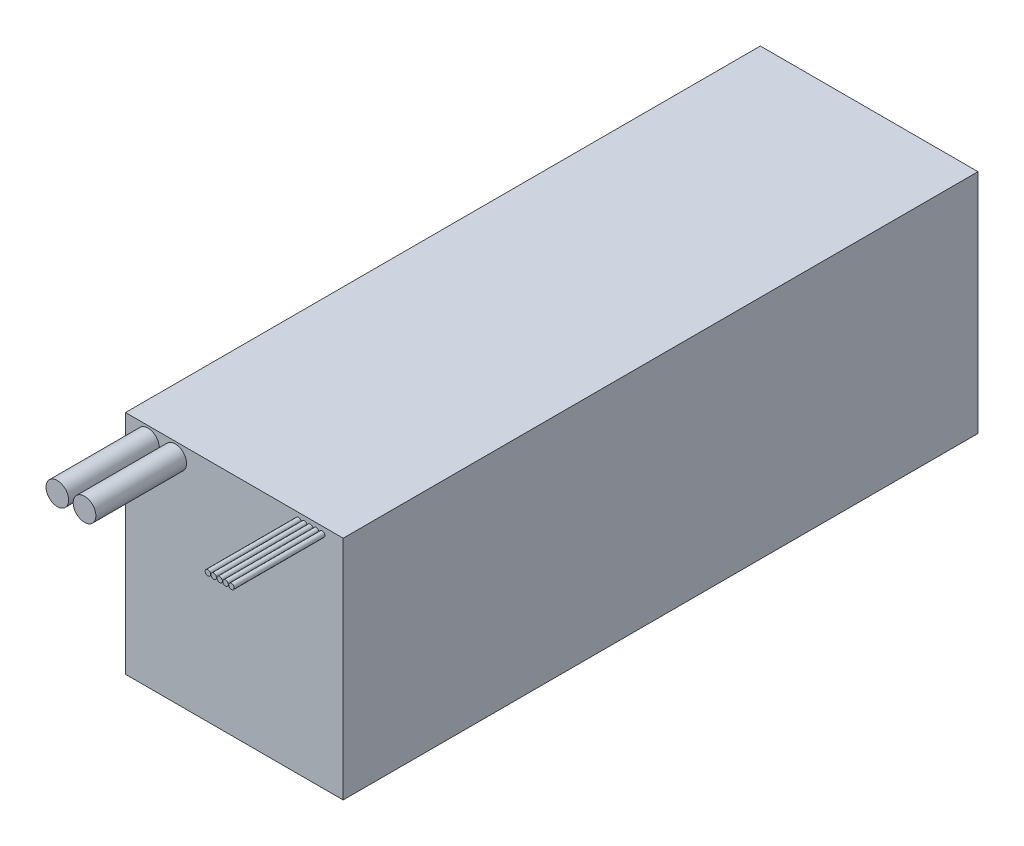
ISO-10303-21;
HEADER;
FILE_DESCRIPTION(('STEP AP214'),'2;1');
FILE_NAME('part.step','',(''),(''),'','','');
FILE_SCHEMA(('AUTOMOTIVE_DESIGN { 1 0 10303 214 1 1 1 1 }'));
ENDSEC;
DATA;
#1=APPLICATION_CONTEXT('core data for automotive mechanical design processes');
#2=APPLICATION_PROTOCOL_DEFINITION('international standard','automotive_design',2000,#1);
#3=PRODUCT_CONTEXT('',#1,'mechanical');
#4=PRODUCT('Part','Part','',(#3));
#5=PRODUCT_RELATED_PRODUCT_CATEGORY('part','',(#4));
#6=PRODUCT_DEFINITION_FORMATION('','',#4);
#7=PRODUCT_DEFINITION_CONTEXT('part definition',#1,'design');
#8=PRODUCT_DEFINITION('design','',#6,#7);
#9=PRODUCT_DEFINITION_SHAPE('','',#8);
#10=(LENGTH_UNIT() NAMED_UNIT(*) SI_UNIT(.MILLI.,.METRE.));
#11=(NAMED_UNIT(*) PLANE_ANGLE_UNIT() SI_UNIT($,.RADIAN.));
#12=(NAMED_UNIT(*) SI_UNIT($,.STERADIAN.) SOLID_ANGLE_UNIT());
#13=UNCERTAINTY_MEASURE_WITH_UNIT(LENGTH_MEASURE(1.E-05),#10,'distance_accuracy_value','');
#14=(GEOMETRIC_REPRESENTATION_CONTEXT(3) GLOBAL_UNCERTAINTY_ASSIGNED_CONTEXT((#13)) GLOBAL_UNIT_ASSIGNED_CONTEXT((#10,
#11,#12)) REPRESENTATION_CONTEXT('',''));
#15=CARTESIAN_POINT('',(0.,0.,0.));
#16=DIRECTION('',(0.,0.,1.));
#17=DIRECTION('',(1.,0.,0.));
#18=AXIS2_PLACEMENT_3D('',#15,#16,#17);
#19=CARTESIAN_POINT('',(-24.,25.,70.));
#20=DIRECTION('',(1.,0.,0.));
#21=DIRECTION('',(0.,1.,0.));
#22=AXIS2_PLACEMENT_3D('',#19,#20,#21);
#23=PLANE('',#22);
#24=DIRECTION('',(0.,-1.,0.));
#25=VECTOR('',#24,1.);
#26=CARTESIAN_POINT('',(-24.,25.,-70.));
#27=LINE('',#26,#25);
#28=CARTESIAN_POINT('',(-24.,25.,-70.));
#29=VERTEX_POINT('',#28);
#30=CARTESIAN_POINT('',(-24.,-25.,-70.));
#31=VERTEX_POINT('',#30);
#32=EDGE_CURVE('E99',#29,#31,#27,.T.);
#33=ORIENTED_EDGE('',*,*,#32,.T.);
#34=DIRECTION('',(0.,0.,-1.));
#35=VECTOR('',#34,1.);
#36=CARTESIAN_POINT('',(-24.,-25.,70.));
#37=LINE('',#36,#35);
#38=CARTESIAN_POINT('',(-24.,-25.,70.));
#39=VERTEX_POINT('',#38);
#40=EDGE_CURVE('E11',#39,#31,#37,.T.);
#41=ORIENTED_EDGE('',*,*,#40,.F.);
#42=DIRECTION('',(0.,-1.,0.));
#43=VECTOR('',#42,1.);
#44=CARTESIAN_POINT('',(-24.,25.,70.));
#45=LINE('',#44,#43);
#46=CARTESIAN_POINT('',(-24.,25.,70.));
#47=VERTEX_POINT('',#46);
#48=EDGE_CURVE('E87',#47,#39,#45,.T.);
#49=ORIENTED_EDGE('',*,*,#48,.F.);
#50=DIRECTION('',(0.,0.,-1.));
#51=VECTOR('',#50,1.);
#52=CARTESIAN_POINT('',(-24.,25.,70.));
#53=LINE('',#52,#51);
#54=EDGE_CURVE('E95',#47,#29,#53,.T.);
#55=ORIENTED_EDGE('',*,*,#54,.T.);
#56=EDGE_LOOP('',(#33,#41,#49,#55));
#57=FACE_BOUND('',#56,.T.);
#58=ADVANCED_FACE('F36',(#57),#23,.F.);
#59=CARTESIAN_POINT('',(-24.,-25.,70.));
#60=DIRECTION('',(0.,1.,0.));
#61=DIRECTION('',(0.,0.,1.));
#62=AXIS2_PLACEMENT_3D('',#59,#60,#61);
#63=PLANE('',#62);
#64=DIRECTION('',(1.,0.,0.));
#65=VECTOR('',#64,1.);
#66=CARTESIAN_POINT('',(-24.,-25.,-70.));
#67=LINE('',#66,#65);
#68=CARTESIAN_POINT('',(24.,-25.,-70.));
#69=VERTEX_POINT('',#68);
#70=EDGE_CURVE('E91',#31,#69,#67,.T.);
#71=ORIENTED_EDGE('',*,*,#70,.T.);
#72=DIRECTION('',(0.,0.,-1.));
#73=VECTOR('',#72,1.);
#74=CARTESIAN_POINT('',(24.,-25.,70.));
#75=LINE('',#74,#73);
#76=CARTESIAN_POINT('',(24.,-25.,70.));
#77=VERTEX_POINT('',#76);
#78=EDGE_CURVE('E44',#77,#69,#75,.T.);
#79=ORIENTED_EDGE('',*,*,#78,.F.);
#80=DIRECTION('',(1.,0.,0.));
#81=VECTOR('',#80,1.);
#82=CARTESIAN_POINT('',(-24.,-25.,70.));
#83=LINE('',#82,#81);
#84=EDGE_CURVE('E82',#39,#77,#83,.T.);
#85=ORIENTED_EDGE('',*,*,#84,.F.);
#86=ORIENTED_EDGE('',*,*,#40,.T.);
#87=EDGE_LOOP('',(#71,#79,#85,#86));
#88=FACE_BOUND('',#87,.T.);
#89=ADVANCED_FACE('F90',(#88),#63,.F.);
#90=CARTESIAN_POINT('',(24.,25.,70.));
#91=DIRECTION('',(-1.,0.,0.));
#92=DIRECTION('',(0.,0.,1.));
#93=AXIS2_PLACEMENT_3D('',#90,#91,#92);
#94=PLANE('',#93);
#95=DIRECTION('',(0.,1.,0.));
#96=VECTOR('',#95,1.);
#97=CARTESIAN_POINT('',(24.,25.,-70.));
#98=LINE('',#97,#96);
#99=CARTESIAN_POINT('',(24.,25.,-70.));
#100=VERTEX_POINT('',#99);
#101=EDGE_CURVE('E69',#69,#100,#98,.T.);
#102=ORIENTED_EDGE('',*,*,#101,.T.);
#103=DIRECTION('',(0.,0.,-1.));
#104=VECTOR('',#103,1.);
#105=CARTESIAN_POINT('',(24.,25.,70.));
#106=LINE('',#105,#104);
#107=CARTESIAN_POINT('',(24.,25.,70.));
#108=VERTEX_POINT('',#107);
#109=EDGE_CURVE('E92',#108,#100,#106,.T.);
#110=ORIENTED_EDGE('',*,*,#109,.F.);
#111=DIRECTION('',(0.,1.,0.));
#112=VECTOR('',#111,1.);
#113=CARTESIAN_POINT('',(24.,25.,70.));
#114=LINE('',#113,#112);
#115=EDGE_CURVE('E85',#77,#108,#114,.T.);
#116=ORIENTED_EDGE('',*,*,#115,.F.);
#117=ORIENTED_EDGE('',*,*,#78,.T.);
#118=EDGE_LOOP('',(#102,#110,#116,#117));
#119=FACE_BOUND('',#118,.T.);
#120=ADVANCED_FACE('F93',(#119),#94,.F.);
#121=CARTESIAN_POINT('',(-24.,25.,70.));
#122=DIRECTION('',(0.,-1.,0.));
#123=DIRECTION('',(0.,0.,-1.));
#124=AXIS2_PLACEMENT_3D('',#121,#122,#123);
#125=PLANE('',#124);
#126=DIRECTION('',(-1.,0.,0.));
#127=VECTOR('',#126,1.);
#128=CARTESIAN_POINT('',(-24.,25.,-70.));
#129=LINE('',#128,#127);
#130=EDGE_CURVE('E75',#100,#29,#129,.T.);
#131=ORIENTED_EDGE('',*,*,#130,.T.);
#132=ORIENTED_EDGE('',*,*,#54,.F.);
#133=DIRECTION('',(-1.,0.,0.));
#134=VECTOR('',#133,1.);
#135=CARTESIAN_POINT('',(-24.,25.,70.));
#136=LINE('',#135,#134);
#137=EDGE_CURVE('E52',#108,#47,#136,.T.);
#138=ORIENTED_EDGE('',*,*,#137,.F.);
#139=ORIENTED_EDGE('',*,*,#109,.T.);
#140=EDGE_LOOP('',(#131,#132,#138,#139));
#141=FACE_BOUND('',#140,.T.);
#142=ADVANCED_FACE('F107',(#141),#125,.F.);
#143=CARTESIAN_POINT('',(0.,0.,70.));
#144=DIRECTION('',(0.,0.,1.));
#145=DIRECTION('',(1.,0.,0.));
#146=AXIS2_PLACEMENT_3D('',#143,#144,#145);
#147=PLANE('',#146);
#148=CARTESIAN_POINT('',(14.1643859394321,23.4802955557702,70.));
#149=DIRECTION('',(0.,0.,1.));
#150=DIRECTION('',(1.,0.,0.));
#151=AXIS2_PLACEMENT_3D('',#148,#149,#150);
#152=CIRCLE('',#151,0.6);
#153=CARTESIAN_POINT('',(14.7643859394321,23.4802955557702,70.));
#154=VERTEX_POINT('',#153);
#155=EDGE_CURVE('E146',#154,#154,#152,.T.);
#156=ORIENTED_EDGE('',*,*,#155,.F.);
#157=EDGE_LOOP('',(#156));
#158=FACE_BOUND('',#157,.T.);
#159=CARTESIAN_POINT('',(19.3643859394321,23.4802955557702,70.));
#160=DIRECTION('',(0.,0.,1.));
#161=DIRECTION('',(1.,0.,0.));
#162=AXIS2_PLACEMENT_3D('',#159,#160,#161);
#163=CIRCLE('',#162,0.6);
#164=CARTESIAN_POINT('',(19.9643859394321,23.4802955557702,70.));
#165=VERTEX_POINT('',#164);
#166=EDGE_CURVE('E140',#165,#165,#163,.T.);
#167=ORIENTED_EDGE('',*,*,#166,.F.);
#168=EDGE_LOOP('',(#167));
#169=FACE_BOUND('',#168,.T.);
#170=CARTESIAN_POINT('',(18.0643859394321,23.4802955557702,70.));
#171=DIRECTION('',(0.,0.,1.));
#172=DIRECTION('',(1.,0.,0.));
#173=AXIS2_PLACEMENT_3D('',#170,#171,#172);
#174=CIRCLE('',#173,0.6);
#175=CARTESIAN_POINT('',(18.6643859394321,23.4802955557702,70.));
#176=VERTEX_POINT('',#175);
#177=EDGE_CURVE('E134',#176,#176,#174,.T.);
#178=ORIENTED_EDGE('',*,*,#177,.F.);
#179=EDGE_LOOP('',(#178));
#180=FACE_BOUND('',#179,.T.);
#181=CARTESIAN_POINT('',(16.7643859394321,23.4802955557702,70.));
#182=DIRECTION('',(0.,0.,1.));
#183=DIRECTION('',(1.,0.,0.));
#184=AXIS2_PLACEMENT_3D('',#181,#182,#183);
#185=CIRCLE('',#184,0.6);
#186=CARTESIAN_POINT('',(17.3643859394321,23.4802955557702,70.));
#187=VERTEX_POINT('',#186);
#188=EDGE_CURVE('E128',#187,#187,#185,.T.);
#189=ORIENTED_EDGE('',*,*,#188,.F.);
#190=EDGE_LOOP('',(#189));
#191=FACE_BOUND('',#190,.T.);
#192=CARTESIAN_POINT('',(15.4643859394321,23.4802955557702,70.));
#193=DIRECTION('',(0.,0.,1.));
#194=DIRECTION('',(1.,0.,0.));
#195=AXIS2_PLACEMENT_3D('',#192,#193,#194);
#196=CIRCLE('',#195,0.600000000000002);
#197=CARTESIAN_POINT('',(16.0643859394321,23.4802955557702,70.));
#198=VERTEX_POINT('',#197);
#199=EDGE_CURVE('E122',#198,#198,#196,.T.);
#200=ORIENTED_EDGE('',*,*,#199,.F.);
#201=EDGE_LOOP('',(#200));
#202=FACE_BOUND('',#201,.T.);
#203=CARTESIAN_POINT('',(-13.0390583199572,22.,70.));
#204=DIRECTION('',(0.,0.,1.));
#205=DIRECTION('',(1.,0.,0.));
#206=AXIS2_PLACEMENT_3D('',#203,#204,#205);
#207=CIRCLE('',#206,2.5);
#208=CARTESIAN_POINT('',(-10.5390583199572,22.,70.));
#209=VERTEX_POINT('',#208);
#210=EDGE_CURVE('E116',#209,#209,#207,.T.);
#211=ORIENTED_EDGE('',*,*,#210,.F.);
#212=EDGE_LOOP('',(#211));
#213=FACE_BOUND('',#212,.T.);
#214=CARTESIAN_POINT('',(-19.0390583199572,22.,70.));
#215=DIRECTION('',(0.,0.,1.));
#216=DIRECTION('',(1.,0.,0.));
#217=AXIS2_PLACEMENT_3D('',#214,#215,#216);
#218=CIRCLE('',#217,2.5);
#219=CARTESIAN_POINT('',(-16.5390583199572,22.,70.));
#220=VERTEX_POINT('',#219);
#221=EDGE_CURVE('E113',#220,#220,#218,.T.);
#222=ORIENTED_EDGE('',*,*,#221,.F.);
#223=EDGE_LOOP('',(#222));
#224=FACE_BOUND('',#223,.T.);
#225=ORIENTED_EDGE('',*,*,#48,.T.);
#226=ORIENTED_EDGE('',*,*,#84,.T.);
#227=ORIENTED_EDGE('',*,*,#115,.T.);
#228=ORIENTED_EDGE('',*,*,#137,.T.);
#229=EDGE_LOOP('',(#225,#226,#227,#228));
#230=FACE_BOUND('',#229,.T.);
#231=ADVANCED_FACE('F83',(#158,#169,#180,#191,#202,#213,#224,#230),#147,.T.);
#232=CARTESIAN_POINT('',(0.,0.,-70.));
#233=DIRECTION('',(0.,0.,1.));
#234=DIRECTION('',(1.,0.,0.));
#235=AXIS2_PLACEMENT_3D('',#232,#233,#234);
#236=PLANE('',#235);
#237=ORIENTED_EDGE('',*,*,#32,.F.);
#238=ORIENTED_EDGE('',*,*,#130,.F.);
#239=ORIENTED_EDGE('',*,*,#101,.F.);
#240=ORIENTED_EDGE('',*,*,#70,.F.);
#241=EDGE_LOOP('',(#237,#238,#239,#240));
#242=FACE_BOUND('',#241,.T.);
#243=ADVANCED_FACE('F110',(#242),#236,.F.);
#244=CARTESIAN_POINT('',(-19.0390583199572,22.,90.));
#245=DIRECTION('',(0.,0.,-1.));
#246=DIRECTION('',(-1.,0.,0.));
#247=AXIS2_PLACEMENT_3D('',#244,#245,#246);
#248=CYLINDRICAL_SURFACE('',#247,2.5);
#249=CARTESIAN_POINT('',(-19.0390583199572,22.,90.));
#250=DIRECTION('',(0.,0.,1.));
#251=DIRECTION('',(1.,0.,0.));
#252=AXIS2_PLACEMENT_3D('',#249,#250,#251);
#253=CIRCLE('',#252,2.5);
#254=CARTESIAN_POINT('',(-16.5390583199572,22.,90.));
#255=VERTEX_POINT('',#254);
#256=EDGE_CURVE('E102',#255,#255,#253,.T.);
#257=ORIENTED_EDGE('',*,*,#256,.F.);
#258=EDGE_LOOP('',(#257));
#259=FACE_BOUND('',#258,.T.);
#260=ORIENTED_EDGE('',*,*,#221,.T.);
#261=EDGE_LOOP('',(#260));
#262=FACE_BOUND('',#261,.T.);
#263=ADVANCED_FACE('F172',(#259,#262),#248,.T.);
#264=CARTESIAN_POINT('',(0.,0.,90.));
#265=DIRECTION('',(0.,0.,1.));
#266=DIRECTION('',(1.,0.,0.));
#267=AXIS2_PLACEMENT_3D('',#264,#265,#266);
#268=PLANE('',#267);
#269=ORIENTED_EDGE('',*,*,#256,.T.);
#270=EDGE_LOOP('',(#269));
#271=FACE_BOUND('',#270,.T.);
#272=ADVANCED_FACE('F174',(#271),#268,.T.);
#273=CARTESIAN_POINT('',(-13.0390583199572,22.,90.));
#274=DIRECTION('',(0.,0.,-1.));
#275=DIRECTION('',(-1.,0.,0.));
#276=AXIS2_PLACEMENT_3D('',#273,#274,#275);
#277=CYLINDRICAL_SURFACE('',#276,2.5);
#278=CARTESIAN_POINT('',(-13.0390583199572,22.,90.));
#279=DIRECTION('',(0.,0.,1.));
#280=DIRECTION('',(1.,0.,0.));
#281=AXIS2_PLACEMENT_3D('',#278,#279,#280);
#282=CIRCLE('',#281,2.5);
#283=CARTESIAN_POINT('',(-10.5390583199572,22.,90.));
#284=VERTEX_POINT('',#283);
#285=EDGE_CURVE('E119',#284,#284,#282,.T.);
#286=ORIENTED_EDGE('',*,*,#285,.F.);
#287=EDGE_LOOP('',(#286));
#288=FACE_BOUND('',#287,.T.);
#289=ORIENTED_EDGE('',*,*,#210,.T.);
#290=EDGE_LOOP('',(#289));
#291=FACE_BOUND('',#290,.T.);
#292=ADVANCED_FACE('F181',(#288,#291),#277,.T.);
#293=CARTESIAN_POINT('',(0.,0.,90.));
#294=DIRECTION('',(0.,0.,1.));
#295=DIRECTION('',(1.,0.,0.));
#296=AXIS2_PLACEMENT_3D('',#293,#294,#295);
#297=PLANE('',#296);
#298=ORIENTED_EDGE('',*,*,#285,.T.);
#299=EDGE_LOOP('',(#298));
#300=FACE_BOUND('',#299,.T.);
#301=ADVANCED_FACE('F231',(#300),#297,.T.);
#302=CARTESIAN_POINT('',(15.4643859394321,23.4802955557702,90.));
#303=DIRECTION('',(0.,0.,-1.));
#304=DIRECTION('',(-1.,0.,0.));
#305=AXIS2_PLACEMENT_3D('',#302,#303,#304);
#306=CYLINDRICAL_SURFACE('',#305,0.600000000000002);
#307=CARTESIAN_POINT('',(15.4643859394321,23.4802955557702,90.));
#308=DIRECTION('',(0.,0.,1.));
#309=DIRECTION('',(1.,0.,0.));
#310=AXIS2_PLACEMENT_3D('',#307,#308,#309);
#311=CIRCLE('',#310,0.600000000000002);
#312=CARTESIAN_POINT('',(16.0643859394321,23.4802955557702,90.));
#313=VERTEX_POINT('',#312);
#314=EDGE_CURVE('E125',#313,#313,#311,.T.);
#315=ORIENTED_EDGE('',*,*,#314,.F.);
#316=EDGE_LOOP('',(#315));
#317=FACE_BOUND('',#316,.T.);
#318=ORIENTED_EDGE('',*,*,#199,.T.);
#319=EDGE_LOOP('',(#318));
#320=FACE_BOUND('',#319,.T.);
#321=ADVANCED_FACE('F241',(#317,#320),#306,.T.);
#322=CARTESIAN_POINT('',(0.,0.,90.));
#323=DIRECTION('',(0.,0.,1.));
#324=DIRECTION('',(1.,0.,0.));
#325=AXIS2_PLACEMENT_3D('',#322,#323,#324);
#326=PLANE('',#325);
#327=ORIENTED_EDGE('',*,*,#314,.T.);
#328=EDGE_LOOP('',(#327));
#329=FACE_BOUND('',#328,.T.);
#330=ADVANCED_FACE('F251',(#329),#326,.T.);
#331=CARTESIAN_POINT('',(16.7643859394321,23.4802955557702,90.));
#332=DIRECTION('',(0.,0.,-1.));
#333=DIRECTION('',(-1.,0.,0.));
#334=AXIS2_PLACEMENT_3D('',#331,#332,#333);
#335=CYLINDRICAL_SURFACE('',#334,0.6);
#336=CARTESIAN_POINT('',(16.7643859394321,23.4802955557702,90.));
#337=DIRECTION('',(0.,0.,1.));
#338=DIRECTION('',(1.,0.,0.));
#339=AXIS2_PLACEMENT_3D('',#336,#337,#338);
#340=CIRCLE('',#339,0.6);
#341=CARTESIAN_POINT('',(17.3643859394321,23.4802955557702,90.));
#342=VERTEX_POINT('',#341);
#343=EDGE_CURVE('E131',#342,#342,#340,.T.);
#344=ORIENTED_EDGE('',*,*,#343,.F.);
#345=EDGE_LOOP('',(#344));
#346=FACE_BOUND('',#345,.T.);
#347=ORIENTED_EDGE('',*,*,#188,.T.);
#348=EDGE_LOOP('',(#347));
#349=FACE_BOUND('',#348,.T.);
#350=ADVANCED_FACE('F261',(#346,#349),#335,.T.);
#351=CARTESIAN_POINT('',(0.,0.,90.));
#352=DIRECTION('',(0.,0.,1.));
#353=DIRECTION('',(1.,0.,0.));
#354=AXIS2_PLACEMENT_3D('',#351,#352,#353);
#355=PLANE('',#354);
#356=ORIENTED_EDGE('',*,*,#343,.T.);
#357=EDGE_LOOP('',(#356));
#358=FACE_BOUND('',#357,.T.);
#359=ADVANCED_FACE('F271',(#358),#355,.T.);
#360=CARTESIAN_POINT('',(18.0643859394321,23.4802955557702,90.));
#361=DIRECTION('',(0.,0.,-1.));
#362=DIRECTION('',(-1.,0.,0.));
#363=AXIS2_PLACEMENT_3D('',#360,#361,#362);
#364=CYLINDRICAL_SURFACE('',#363,0.6);
#365=CARTESIAN_POINT('',(18.0643859394321,23.4802955557702,90.));
#366=DIRECTION('',(0.,0.,1.));
#367=DIRECTION('',(1.,0.,0.));
#368=AXIS2_PLACEMENT_3D('',#365,#366,#367);
#369=CIRCLE('',#368,0.6);
#370=CARTESIAN_POINT('',(18.6643859394321,23.4802955557702,90.));
#371=VERTEX_POINT('',#370);
#372=EDGE_CURVE('E137',#371,#371,#369,.T.);
#373=ORIENTED_EDGE('',*,*,#372,.F.);
#374=EDGE_LOOP('',(#373));
#375=FACE_BOUND('',#374,.T.);
#376=ORIENTED_EDGE('',*,*,#177,.T.);
#377=EDGE_LOOP('',(#376));
#378=FACE_BOUND('',#377,.T.);
#379=ADVANCED_FACE('F281',(#375,#378),#364,.T.);
#380=CARTESIAN_POINT('',(0.,0.,90.));
#381=DIRECTION('',(0.,0.,1.));
#382=DIRECTION('',(1.,0.,0.));
#383=AXIS2_PLACEMENT_3D('',#380,#381,#382);
#384=PLANE('',#383);
#385=ORIENTED_EDGE('',*,*,#372,.T.);
#386=EDGE_LOOP('',(#385));
#387=FACE_BOUND('',#386,.T.);
#388=ADVANCED_FACE('F291',(#387),#384,.T.);
#389=CARTESIAN_POINT('',(19.3643859394321,23.4802955557702,90.));
#390=DIRECTION('',(0.,0.,-1.));
#391=DIRECTION('',(-1.,0.,0.));
#392=AXIS2_PLACEMENT_3D('',#389,#390,#391);
#393=CYLINDRICAL_SURFACE('',#392,0.6);
#394=CARTESIAN_POINT('',(19.3643859394321,23.4802955557702,90.));
#395=DIRECTION('',(0.,0.,1.));
#396=DIRECTION('',(1.,0.,0.));
#397=AXIS2_PLACEMENT_3D('',#394,#395,#396);
#398=CIRCLE('',#397,0.6);
#399=CARTESIAN_POINT('',(19.9643859394321,23.4802955557702,90.));
#400=VERTEX_POINT('',#399);
#401=EDGE_CURVE('E143',#400,#400,#398,.T.);
#402=ORIENTED_EDGE('',*,*,#401,.F.);
#403=EDGE_LOOP('',(#402));
#404=FACE_BOUND('',#403,.T.);
#405=ORIENTED_EDGE('',*,*,#166,.T.);
#406=EDGE_LOOP('',(#405));
#407=FACE_BOUND('',#406,.T.);
#408=ADVANCED_FACE('F301',(#404,#407),#393,.T.);
#409=CARTESIAN_POINT('',(0.,0.,90.));
#410=DIRECTION('',(0.,0.,1.));
#411=DIRECTION('',(1.,0.,0.));
#412=AXIS2_PLACEMENT_3D('',#409,#410,#411);
#413=PLANE('',#412);
#414=ORIENTED_EDGE('',*,*,#401,.T.);
#415=EDGE_LOOP('',(#414));
#416=FACE_BOUND('',#415,.T.);
#417=ADVANCED_FACE('F311',(#416),#413,.T.);
#418=CARTESIAN_POINT('',(14.1643859394321,23.4802955557702,90.));
#419=DIRECTION('',(0.,0.,-1.));
#420=DIRECTION('',(-1.,0.,0.));
#421=AXIS2_PLACEMENT_3D('',#418,#419,#420);
#422=CYLINDRICAL_SURFACE('',#421,0.6);
#423=CARTESIAN_POINT('',(14.1643859394321,23.4802955557702,90.));
#424=DIRECTION('',(0.,0.,1.));
#425=DIRECTION('',(1.,0.,0.));
#426=AXIS2_PLACEMENT_3D('',#423,#424,#425);
#427=CIRCLE('',#426,0.6);
#428=CARTESIAN_POINT('',(14.7643859394321,23.4802955557702,90.));
#429=VERTEX_POINT('',#428);
#430=EDGE_CURVE('E149',#429,#429,#427,.T.);
#431=ORIENTED_EDGE('',*,*,#430,.F.);
#432=EDGE_LOOP('',(#431));
#433=FACE_BOUND('',#432,.T.);
#434=ORIENTED_EDGE('',*,*,#155,.T.);
#435=EDGE_LOOP('',(#434));
#436=FACE_BOUND('',#435,.T.);
#437=ADVANCED_FACE('F155',(#433,#436),#422,.T.);
#438=CARTESIAN_POINT('',(14.1643859394321,23.4802955557702,90.));
#439=DIRECTION('',(0.,0.,1.));
#440=DIRECTION('',(1.,0.,0.));
#441=AXIS2_PLACEMENT_3D('',#438,#439,#440);
#442=PLANE('',#441);
#443=ORIENTED_EDGE('',*,*,#430,.T.);
#444=EDGE_LOOP('',(#443));
#445=FACE_BOUND('',#444,.T.);
#446=ADVANCED_FACE('F330',(#445),#442,.T.);
#447=CLOSED_SHELL('',(#58,#89,#120,#142,#231,#243,#263,#272,#292,#301,#321,#330,#350,#359,#379,
#388,#408,#417,#437,#446));
#448=MANIFOLD_SOLID_BREP('B2',#447);
#449=ADVANCED_BREP_SHAPE_REPRESENTATION('',(#18,#448),#14);
#450=SHAPE_DEFINITION_REPRESENTATION(#9,#449);
ENDSEC;
END-ISO-10303-21;
